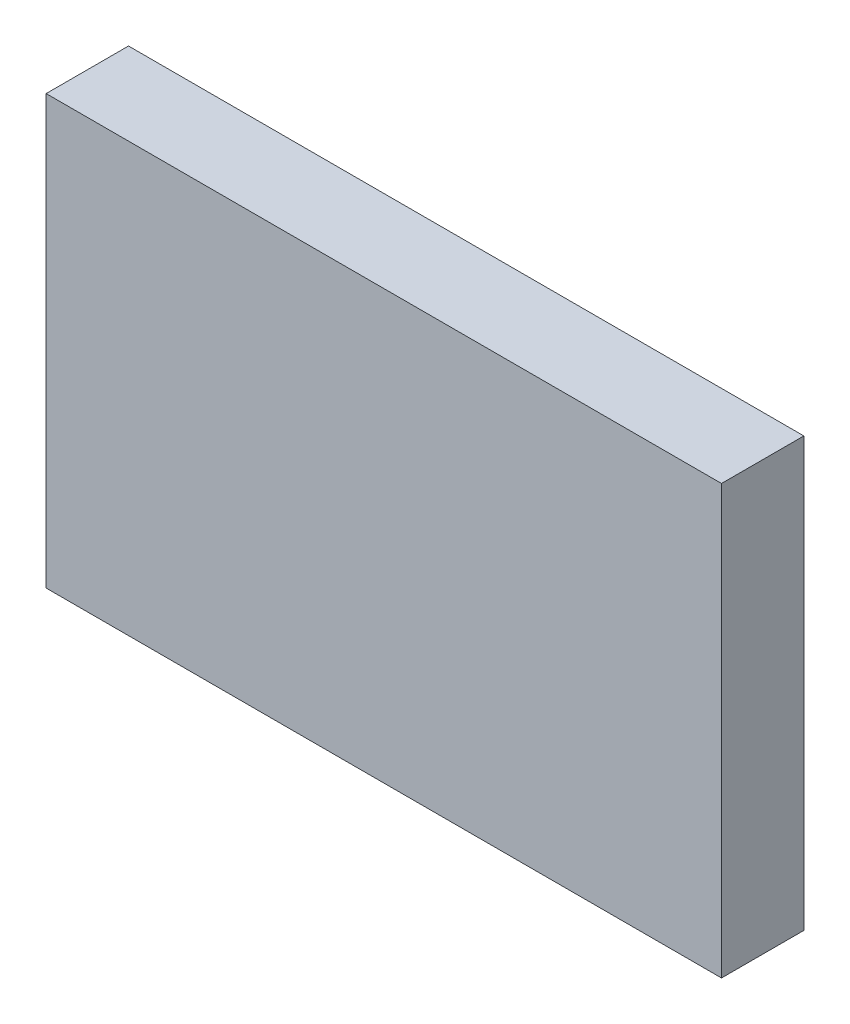
ISO-10303-21;
HEADER;
FILE_DESCRIPTION(('STEP AP214'),'2;1');
FILE_NAME('part.step','',(''),(''),'','','');
FILE_SCHEMA(('AUTOMOTIVE_DESIGN { 1 0 10303 214 1 1 1 1 }'));
ENDSEC;
DATA;
#1=APPLICATION_CONTEXT('core data for automotive mechanical design processes');
#2=APPLICATION_PROTOCOL_DEFINITION('international standard','automotive_design',2000,#1);
#3=PRODUCT_CONTEXT('',#1,'mechanical');
#4=PRODUCT('Part','Part','',(#3));
#5=PRODUCT_RELATED_PRODUCT_CATEGORY('part','',(#4));
#6=PRODUCT_DEFINITION_FORMATION('','',#4);
#7=PRODUCT_DEFINITION_CONTEXT('part definition',#1,'design');
#8=PRODUCT_DEFINITION('design','',#6,#7);
#9=PRODUCT_DEFINITION_SHAPE('','',#8);
#10=(LENGTH_UNIT() NAMED_UNIT(*) SI_UNIT(.MILLI.,.METRE.));
#11=(NAMED_UNIT(*) PLANE_ANGLE_UNIT() SI_UNIT($,.RADIAN.));
#12=(NAMED_UNIT(*) SI_UNIT($,.STERADIAN.) SOLID_ANGLE_UNIT());
#13=UNCERTAINTY_MEASURE_WITH_UNIT(LENGTH_MEASURE(1.E-05),#10,'distance_accuracy_value','');
#14=(GEOMETRIC_REPRESENTATION_CONTEXT(3) GLOBAL_UNCERTAINTY_ASSIGNED_CONTEXT((#13)) GLOBAL_UNIT_ASSIGNED_CONTEXT((#10,
#11,#12)) REPRESENTATION_CONTEXT('',''));
#15=CARTESIAN_POINT('',(0.,0.,0.));
#16=DIRECTION('',(0.,0.,1.));
#17=DIRECTION('',(1.,0.,0.));
#18=AXIS2_PLACEMENT_3D('',#15,#16,#17);
#19=CARTESIAN_POINT('',(41.,-26.,10.));
#20=DIRECTION('',(-1.,0.,0.));
#21=DIRECTION('',(0.,0.,1.));
#22=AXIS2_PLACEMENT_3D('',#19,#20,#21);
#23=PLANE('',#22);
#24=DIRECTION('',(0.,1.,0.));
#25=VECTOR('',#24,1.);
#26=CARTESIAN_POINT('',(41.,-26.,0.));
#27=LINE('',#26,#25);
#28=CARTESIAN_POINT('',(41.,-26.,0.));
#29=VERTEX_POINT('',#28);
#30=CARTESIAN_POINT('',(41.,26.,0.));
#31=VERTEX_POINT('',#30);
#32=EDGE_CURVE('E97',#29,#31,#27,.T.);
#33=ORIENTED_EDGE('',*,*,#32,.T.);
#34=DIRECTION('',(0.,0.,-1.));
#35=VECTOR('',#34,1.);
#36=CARTESIAN_POINT('',(41.,26.,10.));
#37=LINE('',#36,#35);
#38=CARTESIAN_POINT('',(41.,26.,10.));
#39=VERTEX_POINT('',#38);
#40=EDGE_CURVE('E11',#39,#31,#37,.T.);
#41=ORIENTED_EDGE('',*,*,#40,.F.);
#42=DIRECTION('',(0.,1.,0.));
#43=VECTOR('',#42,1.);
#44=CARTESIAN_POINT('',(41.,-26.,10.));
#45=LINE('',#44,#43);
#46=CARTESIAN_POINT('',(41.,-26.,10.));
#47=VERTEX_POINT('',#46);
#48=EDGE_CURVE('E85',#47,#39,#45,.T.);
#49=ORIENTED_EDGE('',*,*,#48,.F.);
#50=DIRECTION('',(0.,0.,-1.));
#51=VECTOR('',#50,1.);
#52=CARTESIAN_POINT('',(41.,-26.,10.));
#53=LINE('',#52,#51);
#54=EDGE_CURVE('E93',#47,#29,#53,.T.);
#55=ORIENTED_EDGE('',*,*,#54,.T.);
#56=EDGE_LOOP('',(#33,#41,#49,#55));
#57=FACE_BOUND('',#56,.T.);
#58=ADVANCED_FACE('F34',(#57),#23,.F.);
#59=CARTESIAN_POINT('',(-41.,26.,10.));
#60=DIRECTION('',(0.,-1.,0.));
#61=DIRECTION('',(0.,0.,-1.));
#62=AXIS2_PLACEMENT_3D('',#59,#60,#61);
#63=PLANE('',#62);
#64=DIRECTION('',(-1.,0.,0.));
#65=VECTOR('',#64,1.);
#66=CARTESIAN_POINT('',(-41.,26.,0.));
#67=LINE('',#66,#65);
#68=CARTESIAN_POINT('',(-41.,26.,0.));
#69=VERTEX_POINT('',#68);
#70=EDGE_CURVE('E89',#31,#69,#67,.T.);
#71=ORIENTED_EDGE('',*,*,#70,.T.);
#72=DIRECTION('',(0.,0.,-1.));
#73=VECTOR('',#72,1.);
#74=CARTESIAN_POINT('',(-41.,26.,10.));
#75=LINE('',#74,#73);
#76=CARTESIAN_POINT('',(-41.,26.,10.));
#77=VERTEX_POINT('',#76);
#78=EDGE_CURVE('E42',#77,#69,#75,.T.);
#79=ORIENTED_EDGE('',*,*,#78,.F.);
#80=DIRECTION('',(-1.,0.,0.));
#81=VECTOR('',#80,1.);
#82=CARTESIAN_POINT('',(-41.,26.,10.));
#83=LINE('',#82,#81);
#84=EDGE_CURVE('E80',#39,#77,#83,.T.);
#85=ORIENTED_EDGE('',*,*,#84,.F.);
#86=ORIENTED_EDGE('',*,*,#40,.T.);
#87=EDGE_LOOP('',(#71,#79,#85,#86));
#88=FACE_BOUND('',#87,.T.);
#89=ADVANCED_FACE('F88',(#88),#63,.F.);
#90=CARTESIAN_POINT('',(-41.,-26.,10.));
#91=DIRECTION('',(1.,0.,0.));
#92=DIRECTION('',(0.,0.,-1.));
#93=AXIS2_PLACEMENT_3D('',#90,#91,#92);
#94=PLANE('',#93);
#95=DIRECTION('',(0.,-1.,0.));
#96=VECTOR('',#95,1.);
#97=CARTESIAN_POINT('',(-41.,-26.,0.));
#98=LINE('',#97,#96);
#99=CARTESIAN_POINT('',(-41.,-26.,0.));
#100=VERTEX_POINT('',#99);
#101=EDGE_CURVE('E67',#69,#100,#98,.T.);
#102=ORIENTED_EDGE('',*,*,#101,.T.);
#103=DIRECTION('',(0.,0.,-1.));
#104=VECTOR('',#103,1.);
#105=CARTESIAN_POINT('',(-41.,-26.,10.));
#106=LINE('',#105,#104);
#107=CARTESIAN_POINT('',(-41.,-26.,10.));
#108=VERTEX_POINT('',#107);
#109=EDGE_CURVE('E90',#108,#100,#106,.T.);
#110=ORIENTED_EDGE('',*,*,#109,.F.);
#111=DIRECTION('',(0.,-1.,0.));
#112=VECTOR('',#111,1.);
#113=CARTESIAN_POINT('',(-41.,-26.,10.));
#114=LINE('',#113,#112);
#115=EDGE_CURVE('E83',#77,#108,#114,.T.);
#116=ORIENTED_EDGE('',*,*,#115,.F.);
#117=ORIENTED_EDGE('',*,*,#78,.T.);
#118=EDGE_LOOP('',(#102,#110,#116,#117));
#119=FACE_BOUND('',#118,.T.);
#120=ADVANCED_FACE('F91',(#119),#94,.F.);
#121=CARTESIAN_POINT('',(-41.,-26.,10.));
#122=DIRECTION('',(0.,1.,0.));
#123=DIRECTION('',(0.,0.,1.));
#124=AXIS2_PLACEMENT_3D('',#121,#122,#123);
#125=PLANE('',#124);
#126=DIRECTION('',(1.,0.,0.));
#127=VECTOR('',#126,1.);
#128=CARTESIAN_POINT('',(-41.,-26.,0.));
#129=LINE('',#128,#127);
#130=EDGE_CURVE('E73',#100,#29,#129,.T.);
#131=ORIENTED_EDGE('',*,*,#130,.T.);
#132=ORIENTED_EDGE('',*,*,#54,.F.);
#133=DIRECTION('',(1.,0.,0.));
#134=VECTOR('',#133,1.);
#135=CARTESIAN_POINT('',(-41.,-26.,10.));
#136=LINE('',#135,#134);
#137=EDGE_CURVE('E50',#108,#47,#136,.T.);
#138=ORIENTED_EDGE('',*,*,#137,.F.);
#139=ORIENTED_EDGE('',*,*,#109,.T.);
#140=EDGE_LOOP('',(#131,#132,#138,#139));
#141=FACE_BOUND('',#140,.T.);
#142=ADVANCED_FACE('F104',(#141),#125,.F.);
#143=CARTESIAN_POINT('',(0.,0.,10.));
#144=DIRECTION('',(0.,0.,-1.));
#145=DIRECTION('',(-1.,0.,0.));
#146=AXIS2_PLACEMENT_3D('',#143,#144,#145);
#147=PLANE('',#146);
#148=ORIENTED_EDGE('',*,*,#48,.T.);
#149=ORIENTED_EDGE('',*,*,#84,.T.);
#150=ORIENTED_EDGE('',*,*,#115,.T.);
#151=ORIENTED_EDGE('',*,*,#137,.T.);
#152=EDGE_LOOP('',(#148,#149,#150,#151));
#153=FACE_BOUND('',#152,.T.);
#154=ADVANCED_FACE('F81',(#153),#147,.F.);
#155=CARTESIAN_POINT('',(0.,0.,0.));
#156=DIRECTION('',(0.,0.,-1.));
#157=DIRECTION('',(-1.,0.,0.));
#158=AXIS2_PLACEMENT_3D('',#155,#156,#157);
#159=PLANE('',#158);
#160=ORIENTED_EDGE('',*,*,#32,.F.);
#161=ORIENTED_EDGE('',*,*,#130,.F.);
#162=ORIENTED_EDGE('',*,*,#101,.F.);
#163=ORIENTED_EDGE('',*,*,#70,.F.);
#164=EDGE_LOOP('',(#160,#161,#162,#163));
#165=FACE_BOUND('',#164,.T.);
#166=ADVANCED_FACE('F107',(#165),#159,.T.);
#167=CLOSED_SHELL('',(#58,#89,#120,#142,#154,#166));
#168=MANIFOLD_SOLID_BREP('B2',#167);
#169=ADVANCED_BREP_SHAPE_REPRESENTATION('',(#18,#168),#14);
#170=SHAPE_DEFINITION_REPRESENTATION(#9,#169);
ENDSEC;
END-ISO-10303-21;
